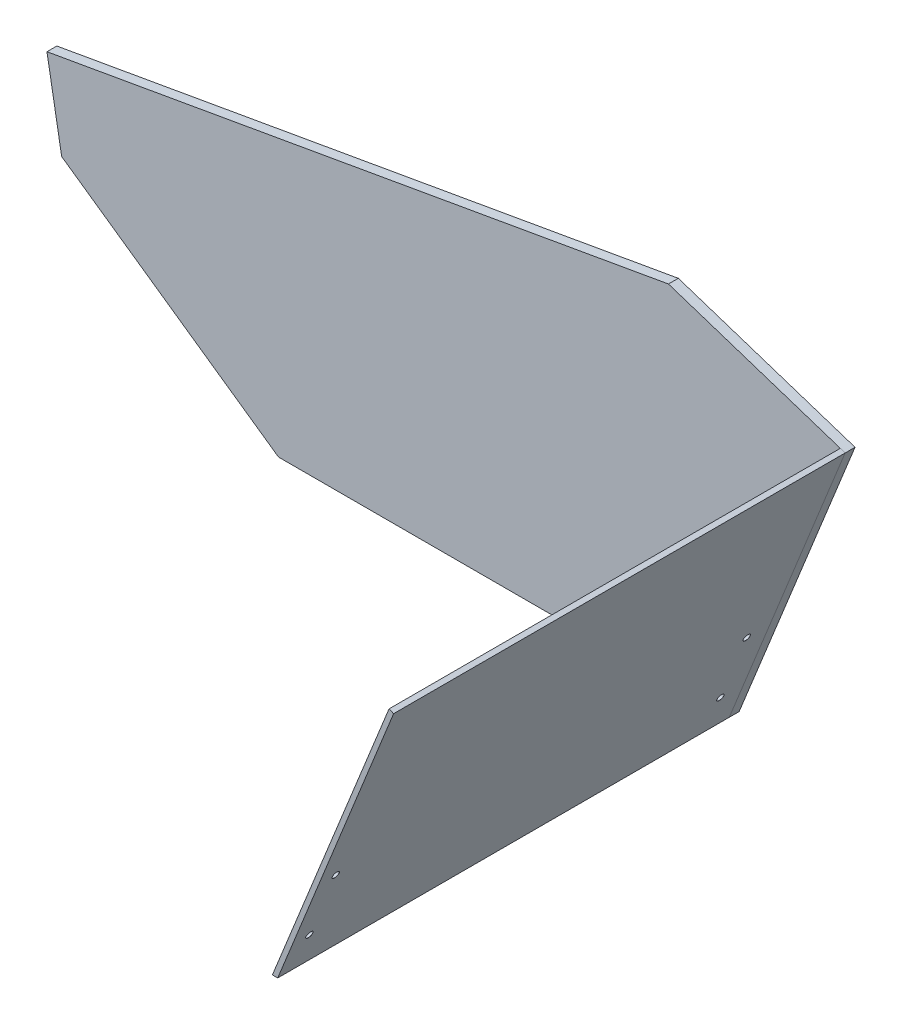
ISO-10303-21;
HEADER;
FILE_DESCRIPTION(('STEP AP214'),'2;1');
FILE_NAME('part.step','',(''),(''),'','','');
FILE_SCHEMA(('AUTOMOTIVE_DESIGN { 1 0 10303 214 1 1 1 1 }'));
ENDSEC;
DATA;
#1=APPLICATION_CONTEXT('core data for automotive mechanical design processes');
#2=APPLICATION_PROTOCOL_DEFINITION('international standard','automotive_design',2000,#1);
#3=PRODUCT_CONTEXT('',#1,'mechanical');
#4=PRODUCT('Part','Part','',(#3));
#5=PRODUCT_RELATED_PRODUCT_CATEGORY('part','',(#4));
#6=PRODUCT_DEFINITION_FORMATION('','',#4);
#7=PRODUCT_DEFINITION_CONTEXT('part definition',#1,'design');
#8=PRODUCT_DEFINITION('design','',#6,#7);
#9=PRODUCT_DEFINITION_SHAPE('','',#8);
#10=(LENGTH_UNIT() NAMED_UNIT(*) SI_UNIT(.MILLI.,.METRE.));
#11=(NAMED_UNIT(*) PLANE_ANGLE_UNIT() SI_UNIT($,.RADIAN.));
#12=(NAMED_UNIT(*) SI_UNIT($,.STERADIAN.) SOLID_ANGLE_UNIT());
#13=UNCERTAINTY_MEASURE_WITH_UNIT(LENGTH_MEASURE(1.E-05),#10,'distance_accuracy_value','');
#14=(GEOMETRIC_REPRESENTATION_CONTEXT(3) GLOBAL_UNCERTAINTY_ASSIGNED_CONTEXT((#13)) GLOBAL_UNIT_ASSIGNED_CONTEXT((#10,
#11,#12)) REPRESENTATION_CONTEXT('',''));
#15=CARTESIAN_POINT('',(0.,0.,0.));
#16=DIRECTION('',(0.,0.,1.));
#17=DIRECTION('',(1.,0.,0.));
#18=AXIS2_PLACEMENT_3D('',#15,#16,#17);
#19=CARTESIAN_POINT('',(217.865127421431,184.247394979262,-6.35));
#20=DIRECTION('',(0.311774612012756,0.950156087863618,0.));
#21=DIRECTION('',(-0.950156087863618,0.311774612012756,0.));
#22=AXIS2_PLACEMENT_3D('',#19,#20,#21);
#23=PLANE('',#22);
#24=DIRECTION('',(-0.950156087863618,0.311774612012756,0.));
#25=VECTOR('',#24,1.);
#26=CARTESIAN_POINT('',(217.865127421431,184.247394979262,0.));
#27=LINE('',#26,#25);
#28=CARTESIAN_POINT('',(217.865127421431,184.247394979262,0.));
#29=VERTEX_POINT('',#28);
#30=CARTESIAN_POINT('',(104.369939008721,221.488558599282,0.));
#31=VERTEX_POINT('',#30);
#32=EDGE_CURVE('E141',#29,#31,#27,.T.);
#33=ORIENTED_EDGE('',*,*,#32,.F.);
#34=DIRECTION('',(0.,0.,1.));
#35=VECTOR('',#34,1.);
#36=CARTESIAN_POINT('',(217.865127421431,184.247394979262,-6.35));
#37=LINE('',#36,#35);
#38=CARTESIAN_POINT('',(217.865127421431,184.247394979262,-6.35));
#39=VERTEX_POINT('',#38);
#40=EDGE_CURVE('E12',#39,#29,#37,.T.);
#41=ORIENTED_EDGE('',*,*,#40,.F.);
#42=DIRECTION('',(-0.950156087863618,0.311774612012756,0.));
#43=VECTOR('',#42,1.);
#44=CARTESIAN_POINT('',(217.865127421431,184.247394979262,-6.35));
#45=LINE('',#44,#43);
#46=CARTESIAN_POINT('',(104.369939008721,221.488558599282,-6.35));
#47=VERTEX_POINT('',#46);
#48=EDGE_CURVE('E155',#39,#47,#45,.T.);
#49=ORIENTED_EDGE('',*,*,#48,.T.);
#50=DIRECTION('',(0.,0.,1.));
#51=VECTOR('',#50,1.);
#52=CARTESIAN_POINT('',(104.369939008721,221.488558599282,-6.35));
#53=LINE('',#52,#51);
#54=EDGE_CURVE('E59',#47,#31,#53,.T.);
#55=ORIENTED_EDGE('',*,*,#54,.T.);
#56=EDGE_LOOP('',(#33,#41,#49,#55));
#57=FACE_BOUND('',#56,.T.);
#58=ADVANCED_FACE('F56',(#57),#23,.T.);
#59=CARTESIAN_POINT('',(143.424347808001,0.,-6.35));
#60=DIRECTION('',(0.927183854566788,-0.374606593415909,0.));
#61=DIRECTION('',(0.374606593415909,0.927183854566789,0.));
#62=AXIS2_PLACEMENT_3D('',#59,#60,#61);
#63=PLANE('',#62);
#64=DIRECTION('',(0.374606593415909,0.927183854566789,0.));
#65=VECTOR('',#64,1.);
#66=CARTESIAN_POINT('',(143.424347808001,0.,0.));
#67=LINE('',#66,#65);
#68=CARTESIAN_POINT('',(143.424347808001,0.,0.));
#69=VERTEX_POINT('',#68);
#70=EDGE_CURVE('E153',#69,#29,#67,.T.);
#71=ORIENTED_EDGE('',*,*,#70,.F.);
#72=DIRECTION('',(0.,0.,1.));
#73=VECTOR('',#72,1.);
#74=CARTESIAN_POINT('',(143.424347808001,0.,-6.35));
#75=LINE('',#74,#73);
#76=CARTESIAN_POINT('',(143.424347808001,0.,-6.35));
#77=VERTEX_POINT('',#76);
#78=EDGE_CURVE('E65',#77,#69,#75,.T.);
#79=ORIENTED_EDGE('',*,*,#78,.F.);
#80=DIRECTION('',(0.374606593415909,0.927183854566789,0.));
#81=VECTOR('',#80,1.);
#82=CARTESIAN_POINT('',(143.424347808001,0.,-6.35));
#83=LINE('',#82,#81);
#84=EDGE_CURVE('E131',#77,#39,#83,.T.);
#85=ORIENTED_EDGE('',*,*,#84,.T.);
#86=ORIENTED_EDGE('',*,*,#40,.T.);
#87=EDGE_LOOP('',(#71,#79,#85,#86));
#88=FACE_BOUND('',#87,.T.);
#89=ADVANCED_FACE('F163',(#88),#63,.T.);
#90=CARTESIAN_POINT('',(143.424347808001,0.,-6.35));
#91=DIRECTION('',(0.,-1.,0.));
#92=DIRECTION('',(1.,0.,0.));
#93=AXIS2_PLACEMENT_3D('',#90,#91,#92);
#94=PLANE('',#93);
#95=DIRECTION('',(1.,0.,0.));
#96=VECTOR('',#95,1.);
#97=CARTESIAN_POINT('',(143.424347808001,0.,0.));
#98=LINE('',#97,#96);
#99=CARTESIAN_POINT('',(-146.070887152194,0.,0.));
#100=VERTEX_POINT('',#99);
#101=EDGE_CURVE('E118',#100,#69,#98,.T.);
#102=ORIENTED_EDGE('',*,*,#101,.F.);
#103=DIRECTION('',(0.,0.,1.));
#104=VECTOR('',#103,1.);
#105=CARTESIAN_POINT('',(-146.070887152194,0.,-6.35));
#106=LINE('',#105,#104);
#107=CARTESIAN_POINT('',(-146.070887152194,0.,-6.35));
#108=VERTEX_POINT('',#107);
#109=EDGE_CURVE('E113',#108,#100,#106,.T.);
#110=ORIENTED_EDGE('',*,*,#109,.F.);
#111=DIRECTION('',(1.,0.,0.));
#112=VECTOR('',#111,1.);
#113=CARTESIAN_POINT('',(143.424347808001,0.,-6.35));
#114=LINE('',#113,#112);
#115=EDGE_CURVE('E116',#108,#77,#114,.T.);
#116=ORIENTED_EDGE('',*,*,#115,.T.);
#117=ORIENTED_EDGE('',*,*,#78,.T.);
#118=EDGE_LOOP('',(#102,#110,#116,#117));
#119=FACE_BOUND('',#118,.T.);
#120=ADVANCED_FACE('F115',(#119),#94,.T.);
#121=CARTESIAN_POINT('',(-285.326734681323,97.5079941796767,-6.35));
#122=DIRECTION('',(-0.57357643635104,-0.819152044288996,0.));
#123=DIRECTION('',(0.819152044288996,-0.57357643635104,0.));
#124=AXIS2_PLACEMENT_3D('',#121,#122,#123);
#125=PLANE('',#124);
#126=DIRECTION('',(0.819152044288996,-0.57357643635104,0.));
#127=VECTOR('',#126,1.);
#128=CARTESIAN_POINT('',(-285.326734681323,97.5079941796767,0.));
#129=LINE('',#128,#127);
#130=CARTESIAN_POINT('',(-285.326734681323,97.5079941796767,0.));
#131=VERTEX_POINT('',#130);
#132=EDGE_CURVE('E150',#131,#100,#129,.T.);
#133=ORIENTED_EDGE('',*,*,#132,.F.);
#134=DIRECTION('',(0.,0.,1.));
#135=VECTOR('',#134,1.);
#136=CARTESIAN_POINT('',(-285.326734681323,97.5079941796767,-6.35));
#137=LINE('',#136,#135);
#138=CARTESIAN_POINT('',(-285.326734681323,97.5079941796767,-6.35));
#139=VERTEX_POINT('',#138);
#140=EDGE_CURVE('E123',#139,#131,#137,.T.);
#141=ORIENTED_EDGE('',*,*,#140,.F.);
#142=DIRECTION('',(0.819152044288996,-0.57357643635104,0.));
#143=VECTOR('',#142,1.);
#144=CARTESIAN_POINT('',(-285.326734681323,97.5079941796767,-6.35));
#145=LINE('',#144,#143);
#146=EDGE_CURVE('E129',#139,#108,#145,.T.);
#147=ORIENTED_EDGE('',*,*,#146,.T.);
#148=ORIENTED_EDGE('',*,*,#109,.T.);
#149=EDGE_LOOP('',(#133,#141,#147,#148));
#150=FACE_BOUND('',#149,.T.);
#151=ADVANCED_FACE('F133',(#150),#125,.T.);
#152=CARTESIAN_POINT('',(-285.326734681323,97.5079941796767,-6.35));
#153=DIRECTION('',(-0.984807753012209,-0.173648177666924,0.));
#154=DIRECTION('',(0.173648177666924,-0.984807753012209,0.));
#155=AXIS2_PLACEMENT_3D('',#152,#153,#154);
#156=PLANE('',#155);
#157=DIRECTION('',(0.173648177666924,-0.984807753012209,0.));
#158=VECTOR('',#157,1.);
#159=CARTESIAN_POINT('',(-285.326734681323,97.5079941796767,0.));
#160=LINE('',#159,#158);
#161=CARTESIAN_POINT('',(-294.777867348171,151.108031047967,0.));
#162=VERTEX_POINT('',#161);
#163=EDGE_CURVE('E147',#162,#131,#160,.T.);
#164=ORIENTED_EDGE('',*,*,#163,.F.);
#165=DIRECTION('',(0.,0.,1.));
#166=VECTOR('',#165,1.);
#167=CARTESIAN_POINT('',(-294.777867348171,151.108031047967,-6.35));
#168=LINE('',#167,#166);
#169=CARTESIAN_POINT('',(-294.777867348171,151.108031047967,-6.35));
#170=VERTEX_POINT('',#169);
#171=EDGE_CURVE('E158',#170,#162,#168,.T.);
#172=ORIENTED_EDGE('',*,*,#171,.F.);
#173=DIRECTION('',(0.173648177666924,-0.984807753012209,0.));
#174=VECTOR('',#173,1.);
#175=CARTESIAN_POINT('',(-285.326734681323,97.5079941796767,-6.35));
#176=LINE('',#175,#174);
#177=EDGE_CURVE('E134',#170,#139,#176,.T.);
#178=ORIENTED_EDGE('',*,*,#177,.T.);
#179=ORIENTED_EDGE('',*,*,#140,.T.);
#180=EDGE_LOOP('',(#164,#172,#178,#179));
#181=FACE_BOUND('',#180,.T.);
#182=ADVANCED_FACE('F176',(#181),#156,.T.);
#183=CARTESIAN_POINT('',(-294.777867348171,151.108031047967,-6.35));
#184=DIRECTION('',(-0.173648177666924,0.984807753012209,0.));
#185=DIRECTION('',(-0.984807753012209,-0.173648177666924,0.));
#186=AXIS2_PLACEMENT_3D('',#183,#184,#185);
#187=PLANE('',#186);
#188=DIRECTION('',(-0.984807753012209,-0.173648177666924,0.));
#189=VECTOR('',#188,1.);
#190=CARTESIAN_POINT('',(-294.777867348171,151.108031047967,0.));
#191=LINE('',#190,#189);
#192=EDGE_CURVE('E144',#31,#162,#191,.T.);
#193=ORIENTED_EDGE('',*,*,#192,.F.);
#194=ORIENTED_EDGE('',*,*,#54,.F.);
#195=DIRECTION('',(-0.984807753012209,-0.173648177666924,0.));
#196=VECTOR('',#195,1.);
#197=CARTESIAN_POINT('',(-294.777867348171,151.108031047967,-6.35));
#198=LINE('',#197,#196);
#199=EDGE_CURVE('E136',#47,#170,#198,.T.);
#200=ORIENTED_EDGE('',*,*,#199,.T.);
#201=ORIENTED_EDGE('',*,*,#171,.T.);
#202=EDGE_LOOP('',(#193,#194,#200,#201));
#203=FACE_BOUND('',#202,.T.);
#204=ADVANCED_FACE('F160',(#203),#187,.T.);
#205=CARTESIAN_POINT('',(0.,0.,-6.35));
#206=DIRECTION('',(0.,0.,-1.));
#207=DIRECTION('',(-1.,0.,0.));
#208=AXIS2_PLACEMENT_3D('',#205,#206,#207);
#209=PLANE('',#208);
#210=ORIENTED_EDGE('',*,*,#48,.F.);
#211=ORIENTED_EDGE('',*,*,#84,.F.);
#212=ORIENTED_EDGE('',*,*,#115,.F.);
#213=ORIENTED_EDGE('',*,*,#146,.F.);
#214=ORIENTED_EDGE('',*,*,#177,.F.);
#215=ORIENTED_EDGE('',*,*,#199,.F.);
#216=EDGE_LOOP('',(#210,#211,#212,#213,#214,#215));
#217=FACE_BOUND('',#216,.T.);
#218=ADVANCED_FACE('F127',(#217),#209,.T.);
#219=CARTESIAN_POINT('',(0.,0.,0.));
#220=DIRECTION('',(0.,0.,-1.));
#221=DIRECTION('',(-1.,0.,0.));
#222=AXIS2_PLACEMENT_3D('',#219,#220,#221);
#223=PLANE('',#222);
#224=ORIENTED_EDGE('',*,*,#32,.T.);
#225=ORIENTED_EDGE('',*,*,#192,.T.);
#226=ORIENTED_EDGE('',*,*,#163,.T.);
#227=ORIENTED_EDGE('',*,*,#132,.T.);
#228=ORIENTED_EDGE('',*,*,#101,.T.);
#229=ORIENTED_EDGE('',*,*,#70,.T.);
#230=EDGE_LOOP('',(#224,#225,#226,#227,#228,#229));
#231=FACE_BOUND('',#230,.T.);
#232=ADVANCED_FACE('F162',(#231),#223,.F.);
#233=CLOSED_SHELL('',(#58,#89,#120,#151,#182,#204,#218,#232));
#234=MANIFOLD_SOLID_BREP('B2_NOT_SHOWN',#233);
#235=CARTESIAN_POINT('',(214.921318683182,185.436770913358,290.));
#236=DIRECTION('',(0.927183854566788,-0.37460659341591,0.));
#237=DIRECTION('',(0.37460659341591,0.927183854566789,0.));
#238=AXIS2_PLACEMENT_3D('',#235,#236,#237);
#239=PLANE('',#238);
#240=CARTESIAN_POINT('',(166.703000608866,66.0922457537716,279.));
#241=DIRECTION('',(0.927183854566788,-0.37460659341591,0.));
#242=DIRECTION('',(0.37460659341591,0.927183854566789,0.));
#243=AXIS2_PLACEMENT_3D('',#240,#241,#242);
#244=CIRCLE('',#243,2.24999999999995);
#245=CARTESIAN_POINT('',(167.545865444052,68.1784094265469,279.));
#246=VERTEX_POINT('',#245);
#247=EDGE_CURVE('E234',#246,#246,#244,.T.);
#248=ORIENTED_EDGE('',*,*,#247,.T.);
#249=EDGE_LOOP('',(#248));
#250=FACE_BOUND('',#249,.T.);
#251=CARTESIAN_POINT('',(149.84570390515,24.3689722982662,279.));
#252=DIRECTION('',(0.927183854566788,-0.37460659341591,0.));
#253=DIRECTION('',(0.37460659341591,0.927183854566789,0.));
#254=AXIS2_PLACEMENT_3D('',#251,#252,#253);
#255=CIRCLE('',#254,2.24999999999995);
#256=CARTESIAN_POINT('',(150.688568740336,26.4551359710414,279.));
#257=VERTEX_POINT('',#256);
#258=EDGE_CURVE('E326',#257,#257,#255,.T.);
#259=ORIENTED_EDGE('',*,*,#258,.T.);
#260=EDGE_LOOP('',(#259));
#261=FACE_BOUND('',#260,.T.);
#262=CARTESIAN_POINT('',(166.703000608885,66.0922457538185,15.0000000000004));
#263=DIRECTION('',(0.927183854566788,-0.37460659341591,0.));
#264=DIRECTION('',(0.37460659341591,0.927183854566789,0.));
#265=AXIS2_PLACEMENT_3D('',#262,#263,#264);
#266=CIRCLE('',#265,2.24999999999996);
#267=CARTESIAN_POINT('',(167.545865444071,68.1784094265938,15.0000000000004));
#268=VERTEX_POINT('',#267);
#269=EDGE_CURVE('E321',#268,#268,#266,.T.);
#270=ORIENTED_EDGE('',*,*,#269,.T.);
#271=EDGE_LOOP('',(#270));
#272=FACE_BOUND('',#271,.T.);
#273=CARTESIAN_POINT('',(149.845703905169,24.3689722983131,15.0000000000004));
#274=DIRECTION('',(0.927183854566788,-0.37460659341591,0.));
#275=DIRECTION('',(0.37460659341591,0.927183854566789,0.));
#276=AXIS2_PLACEMENT_3D('',#273,#274,#275);
#277=CIRCLE('',#276,2.24999999999996);
#278=CARTESIAN_POINT('',(150.688568740355,26.4551359710883,15.0000000000004));
#279=VERTEX_POINT('',#278);
#280=EDGE_CURVE('E306',#279,#279,#277,.T.);
#281=ORIENTED_EDGE('',*,*,#280,.T.);
#282=EDGE_LOOP('',(#281));
#283=FACE_BOUND('',#282,.T.);
#284=DIRECTION('',(-0.37460659341591,-0.927183854566789,0.));
#285=VECTOR('',#284,1.);
#286=CARTESIAN_POINT('',(214.921318683182,185.436770913358,0.));
#287=LINE('',#286,#285);
#288=CARTESIAN_POINT('',(214.921318683182,185.436770913358,0.));
#289=VERTEX_POINT('',#288);
#290=CARTESIAN_POINT('',(140.,0.,0.));
#291=VERTEX_POINT('',#290);
#292=EDGE_CURVE('E302',#289,#291,#287,.T.);
#293=ORIENTED_EDGE('',*,*,#292,.T.);
#294=DIRECTION('',(0.,0.,-1.));
#295=VECTOR('',#294,1.);
#296=CARTESIAN_POINT('',(140.,0.,290.));
#297=LINE('',#296,#295);
#298=CARTESIAN_POINT('',(140.,0.,290.));
#299=VERTEX_POINT('',#298);
#300=EDGE_CURVE('E54',#299,#291,#297,.T.);
#301=ORIENTED_EDGE('',*,*,#300,.F.);
#302=DIRECTION('',(-0.37460659341591,-0.927183854566789,0.));
#303=VECTOR('',#302,1.);
#304=CARTESIAN_POINT('',(214.921318683182,185.436770913358,290.));
#305=LINE('',#304,#303);
#306=CARTESIAN_POINT('',(214.921318683182,185.436770913358,290.));
#307=VERTEX_POINT('',#306);
#308=EDGE_CURVE('E285',#307,#299,#305,.T.);
#309=ORIENTED_EDGE('',*,*,#308,.F.);
#310=DIRECTION('',(0.,0.,-1.));
#311=VECTOR('',#310,1.);
#312=CARTESIAN_POINT('',(214.921318683182,185.436770913358,290.));
#313=LINE('',#312,#311);
#314=EDGE_CURVE('E298',#307,#289,#313,.T.);
#315=ORIENTED_EDGE('',*,*,#314,.T.);
#316=EDGE_LOOP('',(#293,#301,#309,#315));
#317=FACE_BOUND('',#316,.T.);
#318=ADVANCED_FACE('F231',(#250,#261,#272,#283,#317),#239,.F.);
#319=CARTESIAN_POINT('',(140.,0.,290.));
#320=DIRECTION('',(0.,1.,0.));
#321=DIRECTION('',(-1.,0.,0.));
#322=AXIS2_PLACEMENT_3D('',#319,#320,#321);
#323=PLANE('',#322);
#324=DIRECTION('',(1.,0.,0.));
#325=VECTOR('',#324,1.);
#326=CARTESIAN_POINT('',(140.,0.,0.));
#327=LINE('',#326,#325);
#328=CARTESIAN_POINT('',(143.424347808001,0.,0.));
#329=VERTEX_POINT('',#328);
#330=EDGE_CURVE('E290',#291,#329,#327,.T.);
#331=ORIENTED_EDGE('',*,*,#330,.T.);
#332=DIRECTION('',(0.,0.,-1.));
#333=VECTOR('',#332,1.);
#334=CARTESIAN_POINT('',(143.424347808001,0.,290.));
#335=LINE('',#334,#333);
#336=CARTESIAN_POINT('',(143.424347808001,0.,290.));
#337=VERTEX_POINT('',#336);
#338=EDGE_CURVE('E241',#337,#329,#335,.T.);
#339=ORIENTED_EDGE('',*,*,#338,.F.);
#340=DIRECTION('',(1.,0.,0.));
#341=VECTOR('',#340,1.);
#342=CARTESIAN_POINT('',(140.,0.,290.));
#343=LINE('',#342,#341);
#344=EDGE_CURVE('E280',#299,#337,#343,.T.);
#345=ORIENTED_EDGE('',*,*,#344,.F.);
#346=ORIENTED_EDGE('',*,*,#300,.T.);
#347=EDGE_LOOP('',(#331,#339,#345,#346));
#348=FACE_BOUND('',#347,.T.);
#349=ADVANCED_FACE('F289',(#348),#323,.F.);
#350=CARTESIAN_POINT('',(143.424347808001,0.,290.));
#351=DIRECTION('',(-0.927183854566788,0.374606593415909,0.));
#352=DIRECTION('',(-0.374606593415909,-0.927183854566789,0.));
#353=AXIS2_PLACEMENT_3D('',#350,#351,#352);
#354=PLANE('',#353);
#355=CARTESIAN_POINT('',(169.646809347115,64.9028698196761,279.));
#356=DIRECTION('',(0.927183854566789,-0.37460659341591,0.));
#357=DIRECTION('',(0.37460659341591,0.927183854566789,0.));
#358=AXIS2_PLACEMENT_3D('',#355,#356,#357);
#359=CIRCLE('',#358,2.27499999999997);
#360=CARTESIAN_POINT('',(170.499039347137,67.0122130888155,279.));
#361=VERTEX_POINT('',#360);
#362=EDGE_CURVE('E430',#361,#361,#359,.T.);
#363=ORIENTED_EDGE('',*,*,#362,.F.);
#364=EDGE_LOOP('',(#363));
#365=FACE_BOUND('',#364,.T.);
#366=CARTESIAN_POINT('',(152.7895126434,23.1795963641706,279.));
#367=DIRECTION('',(0.927183854566789,-0.37460659341591,0.));
#368=DIRECTION('',(0.37460659341591,0.927183854566789,0.));
#369=AXIS2_PLACEMENT_3D('',#366,#367,#368);
#370=CIRCLE('',#369,2.27499999999997);
#371=CARTESIAN_POINT('',(153.641742643421,25.28893963331,279.));
#372=VERTEX_POINT('',#371);
#373=EDGE_CURVE('E338',#372,#372,#370,.T.);
#374=ORIENTED_EDGE('',*,*,#373,.F.);
#375=EDGE_LOOP('',(#374));
#376=FACE_BOUND('',#375,.T.);
#377=CARTESIAN_POINT('',(169.646809347134,64.902869819723,15.0000000000004));
#378=DIRECTION('',(0.927183854566789,-0.37460659341591,0.));
#379=DIRECTION('',(0.37460659341591,0.927183854566789,0.));
#380=AXIS2_PLACEMENT_3D('',#377,#378,#379);
#381=CIRCLE('',#380,2.275);
#382=CARTESIAN_POINT('',(170.499039347156,67.0122130888624,15.0000000000004));
#383=VERTEX_POINT('',#382);
#384=EDGE_CURVE('E329',#383,#383,#381,.T.);
#385=ORIENTED_EDGE('',*,*,#384,.F.);
#386=EDGE_LOOP('',(#385));
#387=FACE_BOUND('',#386,.T.);
#388=CARTESIAN_POINT('',(152.789512643418,23.1795963642175,15.0000000000004));
#389=DIRECTION('',(0.927183854566789,-0.37460659341591,0.));
#390=DIRECTION('',(0.37460659341591,0.927183854566789,0.));
#391=AXIS2_PLACEMENT_3D('',#388,#389,#390);
#392=CIRCLE('',#391,2.275);
#393=CARTESIAN_POINT('',(153.64174264344,25.288939633357,15.0000000000004));
#394=VERTEX_POINT('',#393);
#395=EDGE_CURVE('E324',#394,#394,#392,.T.);
#396=ORIENTED_EDGE('',*,*,#395,.F.);
#397=EDGE_LOOP('',(#396));
#398=FACE_BOUND('',#397,.T.);
#399=DIRECTION('',(0.374606593415909,0.927183854566789,0.));
#400=VECTOR('',#399,1.);
#401=CARTESIAN_POINT('',(143.424347808001,0.,0.));
#402=LINE('',#401,#400);
#403=CARTESIAN_POINT('',(217.865127421431,184.247394979262,0.));
#404=VERTEX_POINT('',#403);
#405=EDGE_CURVE('E267',#329,#404,#402,.T.);
#406=ORIENTED_EDGE('',*,*,#405,.T.);
#407=DIRECTION('',(0.,0.,-1.));
#408=VECTOR('',#407,1.);
#409=CARTESIAN_POINT('',(217.865127421431,184.247394979262,290.));
#410=LINE('',#409,#408);
#411=CARTESIAN_POINT('',(217.865127421431,184.247394979262,290.));
#412=VERTEX_POINT('',#411);
#413=EDGE_CURVE('E292',#412,#404,#410,.T.);
#414=ORIENTED_EDGE('',*,*,#413,.F.);
#415=DIRECTION('',(0.374606593415909,0.927183854566789,0.));
#416=VECTOR('',#415,1.);
#417=CARTESIAN_POINT('',(143.424347808001,0.,290.));
#418=LINE('',#417,#416);
#419=EDGE_CURVE('E283',#337,#412,#418,.T.);
#420=ORIENTED_EDGE('',*,*,#419,.F.);
#421=ORIENTED_EDGE('',*,*,#338,.T.);
#422=EDGE_LOOP('',(#406,#414,#420,#421));
#423=FACE_BOUND('',#422,.T.);
#424=ADVANCED_FACE('F294',(#365,#376,#387,#398,#423),#354,.F.);
#425=CARTESIAN_POINT('',(217.865127421431,184.247394979262,290.));
#426=DIRECTION('',(-0.374606593415912,-0.927183854566787,0.));
#427=DIRECTION('',(0.927183854566788,-0.374606593415912,0.));
#428=AXIS2_PLACEMENT_3D('',#425,#426,#427);
#429=PLANE('',#428);
#430=DIRECTION('',(-0.927183854566787,0.374606593415912,0.));
#431=VECTOR('',#430,1.);
#432=CARTESIAN_POINT('',(217.865127421431,184.247394979262,0.));
#433=LINE('',#432,#431);
#434=EDGE_CURVE('E273',#404,#289,#433,.T.);
#435=ORIENTED_EDGE('',*,*,#434,.T.);
#436=ORIENTED_EDGE('',*,*,#314,.F.);
#437=DIRECTION('',(-0.927183854566787,0.374606593415912,0.));
#438=VECTOR('',#437,1.);
#439=CARTESIAN_POINT('',(217.865127421431,184.247394979262,290.));
#440=LINE('',#439,#438);
#441=EDGE_CURVE('E250',#412,#307,#440,.T.);
#442=ORIENTED_EDGE('',*,*,#441,.F.);
#443=ORIENTED_EDGE('',*,*,#413,.T.);
#444=EDGE_LOOP('',(#435,#436,#442,#443));
#445=FACE_BOUND('',#444,.T.);
#446=ADVANCED_FACE('F369',(#445),#429,.F.);
#447=CARTESIAN_POINT('',(0.,0.,290.));
#448=DIRECTION('',(0.,0.,-1.));
#449=DIRECTION('',(-1.,0.,0.));
#450=AXIS2_PLACEMENT_3D('',#447,#448,#449);
#451=PLANE('',#450);
#452=ORIENTED_EDGE('',*,*,#308,.T.);
#453=ORIENTED_EDGE('',*,*,#344,.T.);
#454=ORIENTED_EDGE('',*,*,#419,.T.);
#455=ORIENTED_EDGE('',*,*,#441,.T.);
#456=EDGE_LOOP('',(#452,#453,#454,#455));
#457=FACE_BOUND('',#456,.T.);
#458=ADVANCED_FACE('F281',(#457),#451,.F.);
#459=CARTESIAN_POINT('',(0.,0.,0.));
#460=DIRECTION('',(0.,0.,-1.));
#461=DIRECTION('',(-1.,0.,0.));
#462=AXIS2_PLACEMENT_3D('',#459,#460,#461);
#463=PLANE('',#462);
#464=ORIENTED_EDGE('',*,*,#292,.F.);
#465=ORIENTED_EDGE('',*,*,#434,.F.);
#466=ORIENTED_EDGE('',*,*,#405,.F.);
#467=ORIENTED_EDGE('',*,*,#330,.F.);
#468=EDGE_LOOP('',(#464,#465,#466,#467));
#469=FACE_BOUND('',#468,.T.);
#470=ADVANCED_FACE('F394',(#469),#463,.T.);
#471=CARTESIAN_POINT('',(152.789512643418,23.1795963642175,15.0000000000004));
#472=DIRECTION('',(0.927183854566789,-0.37460659341591,0.));
#473=DIRECTION('',(0.37460659341591,0.927183854566789,0.));
#474=AXIS2_PLACEMENT_3D('',#471,#472,#473);
#475=CYLINDRICAL_SURFACE('',#474,2.24999999999996);
#476=CARTESIAN_POINT('',(152.766333047054,23.1889615290529,15.0000000000004));
#477=DIRECTION('',(0.927183854566789,-0.37460659341591,0.));
#478=DIRECTION('',(0.37460659341591,0.927183854566789,0.));
#479=AXIS2_PLACEMENT_3D('',#476,#477,#478);
#480=CIRCLE('',#479,2.24999999999999);
#481=CARTESIAN_POINT('',(153.60919788224,25.2751252018282,15.0000000000004));
#482=VERTEX_POINT('',#481);
#483=EDGE_CURVE('E320',#482,#482,#480,.T.);
#484=ORIENTED_EDGE('',*,*,#483,.T.);
#485=EDGE_LOOP('',(#484));
#486=FACE_BOUND('',#485,.T.);
#487=ORIENTED_EDGE('',*,*,#280,.F.);
#488=EDGE_LOOP('',(#487));
#489=FACE_BOUND('',#488,.T.);
#490=ADVANCED_FACE('F358',(#486,#489),#475,.F.);
#491=CARTESIAN_POINT('',(152.789512643418,23.1795963642175,15.0000000000004));
#492=DIRECTION('',(0.927183854566789,-0.37460659341591,0.));
#493=DIRECTION('',(0.37460659341591,0.927183854566789,0.));
#494=AXIS2_PLACEMENT_3D('',#491,#492,#493);
#495=CONICAL_SURFACE('',#494,2.275,0.78539816339764);
#496=ORIENTED_EDGE('',*,*,#483,.F.);
#497=EDGE_LOOP('',(#496));
#498=FACE_BOUND('',#497,.T.);
#499=ORIENTED_EDGE('',*,*,#395,.T.);
#500=EDGE_LOOP('',(#499));
#501=FACE_BOUND('',#500,.T.);
#502=ADVANCED_FACE('F361',(#498,#501),#495,.F.);
#503=CARTESIAN_POINT('',(169.646809347134,64.902869819723,15.0000000000004));
#504=DIRECTION('',(0.927183854566789,-0.37460659341591,0.));
#505=DIRECTION('',(0.37460659341591,0.927183854566789,0.));
#506=AXIS2_PLACEMENT_3D('',#503,#504,#505);
#507=CYLINDRICAL_SURFACE('',#506,2.24999999999996);
#508=CARTESIAN_POINT('',(169.62362975077,64.9122349845584,15.0000000000004));
#509=DIRECTION('',(0.927183854566789,-0.37460659341591,0.));
#510=DIRECTION('',(0.37460659341591,0.927183854566789,0.));
#511=AXIS2_PLACEMENT_3D('',#508,#509,#510);
#512=CIRCLE('',#511,2.24999999999999);
#513=CARTESIAN_POINT('',(170.466494585956,66.9983986573337,15.0000000000004));
#514=VERTEX_POINT('',#513);
#515=EDGE_CURVE('E325',#514,#514,#512,.T.);
#516=ORIENTED_EDGE('',*,*,#515,.T.);
#517=EDGE_LOOP('',(#516));
#518=FACE_BOUND('',#517,.T.);
#519=ORIENTED_EDGE('',*,*,#269,.F.);
#520=EDGE_LOOP('',(#519));
#521=FACE_BOUND('',#520,.T.);
#522=ADVANCED_FACE('F364',(#518,#521),#507,.F.);
#523=CARTESIAN_POINT('',(169.646809347134,64.902869819723,15.0000000000004));
#524=DIRECTION('',(0.927183854566789,-0.37460659341591,0.));
#525=DIRECTION('',(0.37460659341591,0.927183854566789,0.));
#526=AXIS2_PLACEMENT_3D('',#523,#524,#525);
#527=CONICAL_SURFACE('',#526,2.275,0.785398163397666);
#528=ORIENTED_EDGE('',*,*,#515,.F.);
#529=EDGE_LOOP('',(#528));
#530=FACE_BOUND('',#529,.T.);
#531=ORIENTED_EDGE('',*,*,#384,.T.);
#532=EDGE_LOOP('',(#531));
#533=FACE_BOUND('',#532,.T.);
#534=ADVANCED_FACE('F404',(#530,#533),#527,.F.);
#535=CARTESIAN_POINT('',(152.7895126434,23.1795963641706,279.));
#536=DIRECTION('',(0.927183854566789,-0.37460659341591,0.));
#537=DIRECTION('',(0.37460659341591,0.927183854566789,0.));
#538=AXIS2_PLACEMENT_3D('',#535,#536,#537);
#539=CYLINDRICAL_SURFACE('',#538,2.24999999999995);
#540=CARTESIAN_POINT('',(152.766333047035,23.188961529006,279.));
#541=DIRECTION('',(0.927183854566789,-0.37460659341591,0.));
#542=DIRECTION('',(0.37460659341591,0.927183854566789,0.));
#543=AXIS2_PLACEMENT_3D('',#540,#541,#542);
#544=CIRCLE('',#543,2.24999999999997);
#545=CARTESIAN_POINT('',(153.609197882221,25.2751252017812,279.));
#546=VERTEX_POINT('',#545);
#547=EDGE_CURVE('E330',#546,#546,#544,.T.);
#548=ORIENTED_EDGE('',*,*,#547,.T.);
#549=EDGE_LOOP('',(#548));
#550=FACE_BOUND('',#549,.T.);
#551=ORIENTED_EDGE('',*,*,#258,.F.);
#552=EDGE_LOOP('',(#551));
#553=FACE_BOUND('',#552,.T.);
#554=ADVANCED_FACE('F408',(#550,#553),#539,.F.);
#555=CARTESIAN_POINT('',(152.7895126434,23.1795963641706,279.));
#556=DIRECTION('',(0.927183854566789,-0.37460659341591,0.));
#557=DIRECTION('',(0.37460659341591,0.927183854566789,0.));
#558=AXIS2_PLACEMENT_3D('',#555,#556,#557);
#559=CONICAL_SURFACE('',#558,2.27499999999997,0.785398163397501);
#560=ORIENTED_EDGE('',*,*,#547,.F.);
#561=EDGE_LOOP('',(#560));
#562=FACE_BOUND('',#561,.T.);
#563=ORIENTED_EDGE('',*,*,#373,.T.);
#564=EDGE_LOOP('',(#563));
#565=FACE_BOUND('',#564,.T.);
#566=ADVANCED_FACE('F412',(#562,#565),#559,.F.);
#567=CARTESIAN_POINT('',(169.646809347115,64.9028698196761,279.));
#568=DIRECTION('',(0.927183854566789,-0.37460659341591,0.));
#569=DIRECTION('',(0.37460659341591,0.927183854566789,0.));
#570=AXIS2_PLACEMENT_3D('',#567,#568,#569);
#571=CYLINDRICAL_SURFACE('',#570,2.24999999999995);
#572=CARTESIAN_POINT('',(169.623629750751,64.9122349845115,279.));
#573=DIRECTION('',(0.927183854566789,-0.37460659341591,0.));
#574=DIRECTION('',(0.37460659341591,0.927183854566789,0.));
#575=AXIS2_PLACEMENT_3D('',#572,#573,#574);
#576=CIRCLE('',#575,2.24999999999997);
#577=CARTESIAN_POINT('',(170.466494585937,66.9983986572867,279.));
#578=VERTEX_POINT('',#577);
#579=EDGE_CURVE('E428',#578,#578,#576,.T.);
#580=ORIENTED_EDGE('',*,*,#579,.T.);
#581=EDGE_LOOP('',(#580));
#582=FACE_BOUND('',#581,.T.);
#583=ORIENTED_EDGE('',*,*,#247,.F.);
#584=EDGE_LOOP('',(#583));
#585=FACE_BOUND('',#584,.T.);
#586=ADVANCED_FACE('F415',(#582,#585),#571,.F.);
#587=CARTESIAN_POINT('',(169.646809347115,64.9028698196761,279.));
#588=DIRECTION('',(0.927183854566789,-0.37460659341591,0.));
#589=DIRECTION('',(0.37460659341591,0.927183854566789,0.));
#590=AXIS2_PLACEMENT_3D('',#587,#588,#589);
#591=CONICAL_SURFACE('',#590,2.27499999999997,0.785398163397527);
#592=ORIENTED_EDGE('',*,*,#579,.F.);
#593=EDGE_LOOP('',(#592));
#594=FACE_BOUND('',#593,.T.);
#595=ORIENTED_EDGE('',*,*,#362,.T.);
#596=EDGE_LOOP('',(#595));
#597=FACE_BOUND('',#596,.T.);
#598=ADVANCED_FACE('F419',(#594,#597),#591,.F.);
#599=CLOSED_SHELL('',(#318,#349,#424,#446,#458,#470,#490,#502,#522,#534,#554,#566,#586,#598));
#600=MANIFOLD_SOLID_BREP('B6',#599);
#601=ADVANCED_BREP_SHAPE_REPRESENTATION('',(#18,#234,#600),#14);
#602=SHAPE_DEFINITION_REPRESENTATION(#9,#601);
ENDSEC;
END-ISO-10303-21;
